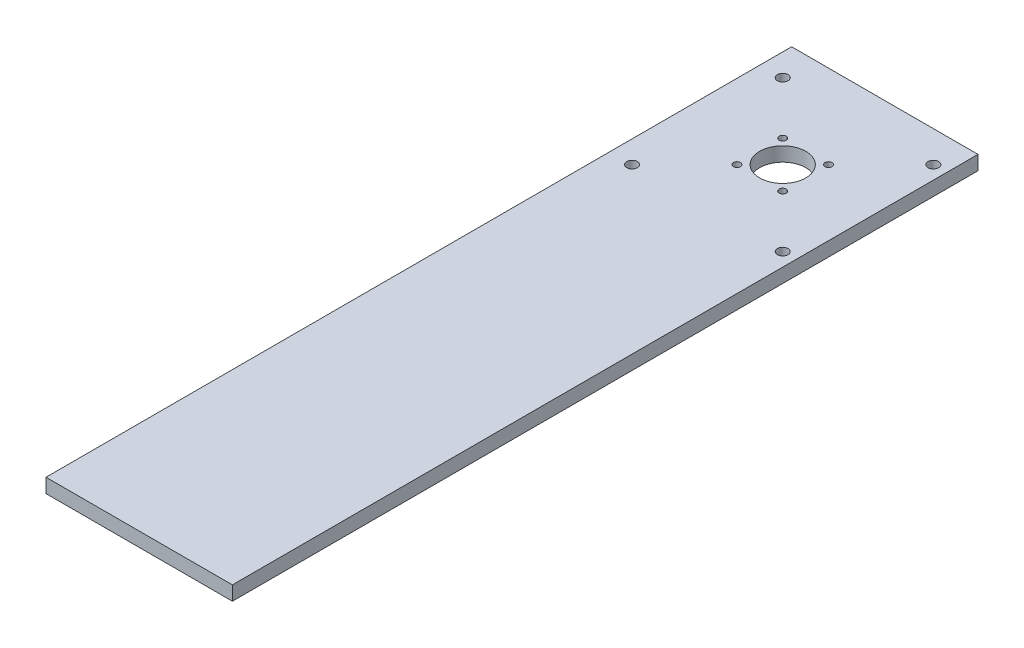
ISO-10303-21;
HEADER;
FILE_DESCRIPTION(('STEP AP214'),'2;1');
FILE_NAME('part.step','',(''),(''),'','','');
FILE_SCHEMA(('AUTOMOTIVE_DESIGN { 1 0 10303 214 1 1 1 1 }'));
ENDSEC;
DATA;
#1=APPLICATION_CONTEXT('core data for automotive mechanical design processes');
#2=APPLICATION_PROTOCOL_DEFINITION('international standard','automotive_design',2000,#1);
#3=PRODUCT_CONTEXT('',#1,'mechanical');
#4=PRODUCT('Part','Part','',(#3));
#5=PRODUCT_RELATED_PRODUCT_CATEGORY('part','',(#4));
#6=PRODUCT_DEFINITION_FORMATION('','',#4);
#7=PRODUCT_DEFINITION_CONTEXT('part definition',#1,'design');
#8=PRODUCT_DEFINITION('design','',#6,#7);
#9=PRODUCT_DEFINITION_SHAPE('','',#8);
#10=(LENGTH_UNIT() NAMED_UNIT(*) SI_UNIT(.MILLI.,.METRE.));
#11=(NAMED_UNIT(*) PLANE_ANGLE_UNIT() SI_UNIT($,.RADIAN.));
#12=(NAMED_UNIT(*) SI_UNIT($,.STERADIAN.) SOLID_ANGLE_UNIT());
#13=UNCERTAINTY_MEASURE_WITH_UNIT(LENGTH_MEASURE(1.E-05),#10,'distance_accuracy_value','');
#14=(GEOMETRIC_REPRESENTATION_CONTEXT(3) GLOBAL_UNCERTAINTY_ASSIGNED_CONTEXT((#13)) GLOBAL_UNIT_ASSIGNED_CONTEXT((#10,
#11,#12)) REPRESENTATION_CONTEXT('',''));
#15=CARTESIAN_POINT('',(0.,0.,0.));
#16=DIRECTION('',(0.,0.,1.));
#17=DIRECTION('',(1.,0.,0.));
#18=AXIS2_PLACEMENT_3D('',#15,#16,#17);
#19=CARTESIAN_POINT('',(0.,8.,0.));
#20=DIRECTION('',(0.,-1.,0.));
#21=DIRECTION('',(0.,0.,-1.));
#22=AXIS2_PLACEMENT_3D('',#19,#20,#21);
#23=PLANE('',#22);
#24=DIRECTION('',(0.,0.,-1.));
#25=VECTOR('',#24,1.);
#26=CARTESIAN_POINT('',(50.,8.,210.));
#27=LINE('',#26,#25);
#28=CARTESIAN_POINT('',(50.,8.,210.));
#29=VERTEX_POINT('',#28);
#30=CARTESIAN_POINT('',(50.,8.,-210.));
#31=VERTEX_POINT('',#30);
#32=EDGE_CURVE('E89',#29,#31,#27,.T.);
#33=ORIENTED_EDGE('',*,*,#32,.T.);
#34=DIRECTION('',(-1.,0.,0.));
#35=VECTOR('',#34,1.);
#36=CARTESIAN_POINT('',(-55.,8.,-210.));
#37=LINE('',#36,#35);
#38=CARTESIAN_POINT('',(-55.,8.,-210.));
#39=VERTEX_POINT('',#38);
#40=EDGE_CURVE('E84',#31,#39,#37,.T.);
#41=ORIENTED_EDGE('',*,*,#40,.T.);
#42=DIRECTION('',(0.,0.,1.));
#43=VECTOR('',#42,1.);
#44=CARTESIAN_POINT('',(-55.,8.,210.));
#45=LINE('',#44,#43);
#46=CARTESIAN_POINT('',(-55.,8.,210.));
#47=VERTEX_POINT('',#46);
#48=EDGE_CURVE('E87',#39,#47,#45,.T.);
#49=ORIENTED_EDGE('',*,*,#48,.T.);
#50=DIRECTION('',(1.,0.,0.));
#51=VECTOR('',#50,1.);
#52=CARTESIAN_POINT('',(-55.,8.,210.));
#53=LINE('',#52,#51);
#54=EDGE_CURVE('E54',#47,#29,#53,.T.);
#55=ORIENTED_EDGE('',*,*,#54,.T.);
#56=EDGE_LOOP('',(#33,#41,#49,#55));
#57=FACE_BOUND('',#56,.T.);
#58=CARTESIAN_POINT('',(0.,8.,-150.));
#59=DIRECTION('',(0.,1.,0.));
#60=DIRECTION('',(0.,0.,1.));
#61=AXIS2_PLACEMENT_3D('',#58,#59,#60);
#62=CIRCLE('',#61,13.);
#63=CARTESIAN_POINT('',(0.,8.,-137.));
#64=VERTEX_POINT('',#63);
#65=EDGE_CURVE('E104',#64,#64,#62,.T.);
#66=ORIENTED_EDGE('',*,*,#65,.F.);
#67=EDGE_LOOP('',(#66));
#68=FACE_BOUND('',#67,.T.);
#69=CARTESIAN_POINT('',(-42.4264068711926,8.,-107.573593128807));
#70=DIRECTION('',(0.,1.,0.));
#71=DIRECTION('',(0.,0.,1.));
#72=AXIS2_PLACEMENT_3D('',#69,#70,#71);
#73=CIRCLE('',#72,3.00000000000006);
#74=CARTESIAN_POINT('',(-42.4264068711926,8.,-104.573593128807));
#75=VERTEX_POINT('',#74);
#76=EDGE_CURVE('E119',#75,#75,#73,.T.);
#77=ORIENTED_EDGE('',*,*,#76,.F.);
#78=EDGE_LOOP('',(#77));
#79=FACE_BOUND('',#78,.T.);
#80=CARTESIAN_POINT('',(-12.9046987566544,8.,-137.095301243345));
#81=DIRECTION('',(0.,1.,0.));
#82=DIRECTION('',(0.,0.,1.));
#83=AXIS2_PLACEMENT_3D('',#80,#81,#82);
#84=CIRCLE('',#83,2.);
#85=CARTESIAN_POINT('',(-12.9046987566544,8.,-135.095301243345));
#86=VERTEX_POINT('',#85);
#87=EDGE_CURVE('E125',#86,#86,#84,.T.);
#88=ORIENTED_EDGE('',*,*,#87,.F.);
#89=EDGE_LOOP('',(#88));
#90=FACE_BOUND('',#89,.T.);
#91=CARTESIAN_POINT('',(-42.4264068711931,8.,-192.426406871193));
#92=DIRECTION('',(0.,1.,0.));
#93=DIRECTION('',(0.,0.,1.));
#94=AXIS2_PLACEMENT_3D('',#91,#92,#93);
#95=CIRCLE('',#94,2.99999999999999);
#96=CARTESIAN_POINT('',(-42.4264068711931,8.,-189.426406871193));
#97=VERTEX_POINT('',#96);
#98=EDGE_CURVE('E131',#97,#97,#95,.T.);
#99=ORIENTED_EDGE('',*,*,#98,.F.);
#100=EDGE_LOOP('',(#99));
#101=FACE_BOUND('',#100,.T.);
#102=CARTESIAN_POINT('',(42.4264068711926,8.,-192.426406871193));
#103=DIRECTION('',(0.,1.,0.));
#104=DIRECTION('',(0.,0.,1.));
#105=AXIS2_PLACEMENT_3D('',#102,#103,#104);
#106=CIRCLE('',#105,3.);
#107=CARTESIAN_POINT('',(42.4264068711926,8.,-189.426406871193));
#108=VERTEX_POINT('',#107);
#109=EDGE_CURVE('E137',#108,#108,#106,.T.);
#110=ORIENTED_EDGE('',*,*,#109,.F.);
#111=EDGE_LOOP('',(#110));
#112=FACE_BOUND('',#111,.T.);
#113=CARTESIAN_POINT('',(42.4264068711931,8.,-107.573593128807));
#114=DIRECTION('',(0.,1.,0.));
#115=DIRECTION('',(0.,0.,1.));
#116=AXIS2_PLACEMENT_3D('',#113,#114,#115);
#117=CIRCLE('',#116,3.00000000000001);
#118=CARTESIAN_POINT('',(42.4264068711931,8.,-104.573593128807));
#119=VERTEX_POINT('',#118);
#120=EDGE_CURVE('E143',#119,#119,#117,.T.);
#121=ORIENTED_EDGE('',*,*,#120,.F.);
#122=EDGE_LOOP('',(#121));
#123=FACE_BOUND('',#122,.T.);
#124=CARTESIAN_POINT('',(-12.9046987566546,8.,-162.904698756654));
#125=DIRECTION('',(0.,1.,0.));
#126=DIRECTION('',(0.,0.,1.));
#127=AXIS2_PLACEMENT_3D('',#124,#125,#126);
#128=CIRCLE('',#127,2.00000000000001);
#129=CARTESIAN_POINT('',(-12.9046987566546,8.,-160.904698756654));
#130=VERTEX_POINT('',#129);
#131=EDGE_CURVE('E149',#130,#130,#128,.T.);
#132=ORIENTED_EDGE('',*,*,#131,.F.);
#133=EDGE_LOOP('',(#132));
#134=FACE_BOUND('',#133,.T.);
#135=CARTESIAN_POINT('',(12.9046987566544,8.,-162.904698756655));
#136=DIRECTION('',(0.,1.,0.));
#137=DIRECTION('',(0.,0.,1.));
#138=AXIS2_PLACEMENT_3D('',#135,#136,#137);
#139=CIRCLE('',#138,2.);
#140=CARTESIAN_POINT('',(12.9046987566544,8.,-160.904698756655));
#141=VERTEX_POINT('',#140);
#142=EDGE_CURVE('E155',#141,#141,#139,.T.);
#143=ORIENTED_EDGE('',*,*,#142,.F.);
#144=EDGE_LOOP('',(#143));
#145=FACE_BOUND('',#144,.T.);
#146=CARTESIAN_POINT('',(12.9046987566546,8.,-137.095301243346));
#147=DIRECTION('',(0.,1.,0.));
#148=DIRECTION('',(0.,0.,1.));
#149=AXIS2_PLACEMENT_3D('',#146,#147,#148);
#150=CIRCLE('',#149,2.00000000000001);
#151=CARTESIAN_POINT('',(12.9046987566546,8.,-135.095301243346));
#152=VERTEX_POINT('',#151);
#153=EDGE_CURVE('E161',#152,#152,#150,.T.);
#154=ORIENTED_EDGE('',*,*,#153,.F.);
#155=EDGE_LOOP('',(#154));
#156=FACE_BOUND('',#155,.T.);
#157=ADVANCED_FACE('F37',(#57,#68,#79,#90,#101,#112,#123,#134,#145,#156),#23,.F.);
#158=CARTESIAN_POINT('',(0.,0.,0.));
#159=DIRECTION('',(0.,-1.,0.));
#160=DIRECTION('',(0.,0.,-1.));
#161=AXIS2_PLACEMENT_3D('',#158,#159,#160);
#162=PLANE('',#161);
#163=CARTESIAN_POINT('',(12.9046987566544,0.,-162.904698756655));
#164=DIRECTION('',(0.,1.,0.));
#165=DIRECTION('',(0.,0.,1.));
#166=AXIS2_PLACEMENT_3D('',#163,#164,#165);
#167=CIRCLE('',#166,2.);
#168=CARTESIAN_POINT('',(12.9046987566544,0.,-160.904698756655));
#169=VERTEX_POINT('',#168);
#170=EDGE_CURVE('E158',#169,#169,#167,.T.);
#171=ORIENTED_EDGE('',*,*,#170,.T.);
#172=EDGE_LOOP('',(#171));
#173=FACE_BOUND('',#172,.T.);
#174=CARTESIAN_POINT('',(42.4264068711931,0.,-107.573593128807));
#175=DIRECTION('',(0.,1.,0.));
#176=DIRECTION('',(0.,0.,1.));
#177=AXIS2_PLACEMENT_3D('',#174,#175,#176);
#178=CIRCLE('',#177,3.00000000000001);
#179=CARTESIAN_POINT('',(42.4264068711931,0.,-104.573593128807));
#180=VERTEX_POINT('',#179);
#181=EDGE_CURVE('E146',#180,#180,#178,.T.);
#182=ORIENTED_EDGE('',*,*,#181,.T.);
#183=EDGE_LOOP('',(#182));
#184=FACE_BOUND('',#183,.T.);
#185=CARTESIAN_POINT('',(-42.4264068711931,0.,-192.426406871193));
#186=DIRECTION('',(0.,1.,0.));
#187=DIRECTION('',(0.,0.,1.));
#188=AXIS2_PLACEMENT_3D('',#185,#186,#187);
#189=CIRCLE('',#188,2.99999999999999);
#190=CARTESIAN_POINT('',(-42.4264068711931,0.,-189.426406871193));
#191=VERTEX_POINT('',#190);
#192=EDGE_CURVE('E134',#191,#191,#189,.T.);
#193=ORIENTED_EDGE('',*,*,#192,.T.);
#194=EDGE_LOOP('',(#193));
#195=FACE_BOUND('',#194,.T.);
#196=CARTESIAN_POINT('',(-42.4264068711926,0.,-107.573593128807));
#197=DIRECTION('',(0.,1.,0.));
#198=DIRECTION('',(0.,0.,1.));
#199=AXIS2_PLACEMENT_3D('',#196,#197,#198);
#200=CIRCLE('',#199,3.00000000000006);
#201=CARTESIAN_POINT('',(-42.4264068711926,0.,-104.573593128807));
#202=VERTEX_POINT('',#201);
#203=EDGE_CURVE('E122',#202,#202,#200,.T.);
#204=ORIENTED_EDGE('',*,*,#203,.T.);
#205=EDGE_LOOP('',(#204));
#206=FACE_BOUND('',#205,.T.);
#207=DIRECTION('',(0.,0.,-1.));
#208=VECTOR('',#207,1.);
#209=CARTESIAN_POINT('',(50.,0.,210.));
#210=LINE('',#209,#208);
#211=CARTESIAN_POINT('',(50.,0.,210.));
#212=VERTEX_POINT('',#211);
#213=CARTESIAN_POINT('',(50.,0.,-210.));
#214=VERTEX_POINT('',#213);
#215=EDGE_CURVE('E101',#212,#214,#210,.T.);
#216=ORIENTED_EDGE('',*,*,#215,.F.);
#217=DIRECTION('',(1.,0.,0.));
#218=VECTOR('',#217,1.);
#219=CARTESIAN_POINT('',(-55.,0.,210.));
#220=LINE('',#219,#218);
#221=CARTESIAN_POINT('',(-55.,0.,210.));
#222=VERTEX_POINT('',#221);
#223=EDGE_CURVE('E77',#222,#212,#220,.T.);
#224=ORIENTED_EDGE('',*,*,#223,.F.);
#225=DIRECTION('',(0.,0.,1.));
#226=VECTOR('',#225,1.);
#227=CARTESIAN_POINT('',(-55.,0.,210.));
#228=LINE('',#227,#226);
#229=CARTESIAN_POINT('',(-55.,0.,-210.));
#230=VERTEX_POINT('',#229);
#231=EDGE_CURVE('E71',#230,#222,#228,.T.);
#232=ORIENTED_EDGE('',*,*,#231,.F.);
#233=DIRECTION('',(-1.,0.,0.));
#234=VECTOR('',#233,1.);
#235=CARTESIAN_POINT('',(-55.,0.,-210.));
#236=LINE('',#235,#234);
#237=EDGE_CURVE('E93',#214,#230,#236,.T.);
#238=ORIENTED_EDGE('',*,*,#237,.F.);
#239=EDGE_LOOP('',(#216,#224,#232,#238));
#240=FACE_BOUND('',#239,.T.);
#241=CARTESIAN_POINT('',(0.,0.,-150.));
#242=DIRECTION('',(0.,1.,0.));
#243=DIRECTION('',(0.,0.,1.));
#244=AXIS2_PLACEMENT_3D('',#241,#242,#243);
#245=CIRCLE('',#244,13.);
#246=CARTESIAN_POINT('',(0.,0.,-137.));
#247=VERTEX_POINT('',#246);
#248=EDGE_CURVE('E116',#247,#247,#245,.T.);
#249=ORIENTED_EDGE('',*,*,#248,.T.);
#250=EDGE_LOOP('',(#249));
#251=FACE_BOUND('',#250,.T.);
#252=CARTESIAN_POINT('',(-12.9046987566544,0.,-137.095301243345));
#253=DIRECTION('',(0.,1.,0.));
#254=DIRECTION('',(0.,0.,1.));
#255=AXIS2_PLACEMENT_3D('',#252,#253,#254);
#256=CIRCLE('',#255,2.);
#257=CARTESIAN_POINT('',(-12.9046987566544,0.,-135.095301243345));
#258=VERTEX_POINT('',#257);
#259=EDGE_CURVE('E128',#258,#258,#256,.T.);
#260=ORIENTED_EDGE('',*,*,#259,.T.);
#261=EDGE_LOOP('',(#260));
#262=FACE_BOUND('',#261,.T.);
#263=CARTESIAN_POINT('',(42.4264068711926,0.,-192.426406871193));
#264=DIRECTION('',(0.,1.,0.));
#265=DIRECTION('',(0.,0.,1.));
#266=AXIS2_PLACEMENT_3D('',#263,#264,#265);
#267=CIRCLE('',#266,3.);
#268=CARTESIAN_POINT('',(42.4264068711926,0.,-189.426406871193));
#269=VERTEX_POINT('',#268);
#270=EDGE_CURVE('E140',#269,#269,#267,.T.);
#271=ORIENTED_EDGE('',*,*,#270,.T.);
#272=EDGE_LOOP('',(#271));
#273=FACE_BOUND('',#272,.T.);
#274=CARTESIAN_POINT('',(-12.9046987566546,0.,-162.904698756654));
#275=DIRECTION('',(0.,1.,0.));
#276=DIRECTION('',(0.,0.,1.));
#277=AXIS2_PLACEMENT_3D('',#274,#275,#276);
#278=CIRCLE('',#277,2.00000000000001);
#279=CARTESIAN_POINT('',(-12.9046987566546,0.,-160.904698756654));
#280=VERTEX_POINT('',#279);
#281=EDGE_CURVE('E152',#280,#280,#278,.T.);
#282=ORIENTED_EDGE('',*,*,#281,.T.);
#283=EDGE_LOOP('',(#282));
#284=FACE_BOUND('',#283,.T.);
#285=CARTESIAN_POINT('',(12.9046987566546,0.,-137.095301243346));
#286=DIRECTION('',(0.,1.,0.));
#287=DIRECTION('',(0.,0.,1.));
#288=AXIS2_PLACEMENT_3D('',#285,#286,#287);
#289=CIRCLE('',#288,2.00000000000001);
#290=CARTESIAN_POINT('',(12.9046987566546,0.,-135.095301243346));
#291=VERTEX_POINT('',#290);
#292=EDGE_CURVE('E164',#291,#291,#289,.T.);
#293=ORIENTED_EDGE('',*,*,#292,.T.);
#294=EDGE_LOOP('',(#293));
#295=FACE_BOUND('',#294,.T.);
#296=ADVANCED_FACE('F112',(#173,#184,#195,#206,#240,#251,#262,#273,#284,#295),#162,.T.);
#297=CARTESIAN_POINT('',(50.,8.,210.));
#298=DIRECTION('',(-1.,0.,0.));
#299=DIRECTION('',(0.,0.,1.));
#300=AXIS2_PLACEMENT_3D('',#297,#298,#299);
#301=PLANE('',#300);
#302=ORIENTED_EDGE('',*,*,#215,.T.);
#303=DIRECTION('',(0.,-1.,0.));
#304=VECTOR('',#303,1.);
#305=CARTESIAN_POINT('',(50.,8.,-210.));
#306=LINE('',#305,#304);
#307=EDGE_CURVE('E11',#31,#214,#306,.T.);
#308=ORIENTED_EDGE('',*,*,#307,.F.);
#309=ORIENTED_EDGE('',*,*,#32,.F.);
#310=DIRECTION('',(0.,-1.,0.));
#311=VECTOR('',#310,1.);
#312=CARTESIAN_POINT('',(50.,8.,210.));
#313=LINE('',#312,#311);
#314=EDGE_CURVE('E97',#29,#212,#313,.T.);
#315=ORIENTED_EDGE('',*,*,#314,.T.);
#316=EDGE_LOOP('',(#302,#308,#309,#315));
#317=FACE_BOUND('',#316,.T.);
#318=ADVANCED_FACE('F39',(#317),#301,.F.);
#319=CARTESIAN_POINT('',(-55.,8.,-210.));
#320=DIRECTION('',(0.,0.,1.));
#321=DIRECTION('',(1.,0.,0.));
#322=AXIS2_PLACEMENT_3D('',#319,#320,#321);
#323=PLANE('',#322);
#324=ORIENTED_EDGE('',*,*,#237,.T.);
#325=DIRECTION('',(0.,-1.,0.));
#326=VECTOR('',#325,1.);
#327=CARTESIAN_POINT('',(-55.,8.,-210.));
#328=LINE('',#327,#326);
#329=EDGE_CURVE('E46',#39,#230,#328,.T.);
#330=ORIENTED_EDGE('',*,*,#329,.F.);
#331=ORIENTED_EDGE('',*,*,#40,.F.);
#332=ORIENTED_EDGE('',*,*,#307,.T.);
#333=EDGE_LOOP('',(#324,#330,#331,#332));
#334=FACE_BOUND('',#333,.T.);
#335=ADVANCED_FACE('F92',(#334),#323,.F.);
#336=CARTESIAN_POINT('',(-55.,8.,210.));
#337=DIRECTION('',(1.,0.,0.));
#338=DIRECTION('',(0.,0.,-1.));
#339=AXIS2_PLACEMENT_3D('',#336,#337,#338);
#340=PLANE('',#339);
#341=ORIENTED_EDGE('',*,*,#231,.T.);
#342=DIRECTION('',(0.,-1.,0.));
#343=VECTOR('',#342,1.);
#344=CARTESIAN_POINT('',(-55.,8.,210.));
#345=LINE('',#344,#343);
#346=EDGE_CURVE('E94',#47,#222,#345,.T.);
#347=ORIENTED_EDGE('',*,*,#346,.F.);
#348=ORIENTED_EDGE('',*,*,#48,.F.);
#349=ORIENTED_EDGE('',*,*,#329,.T.);
#350=EDGE_LOOP('',(#341,#347,#348,#349));
#351=FACE_BOUND('',#350,.T.);
#352=ADVANCED_FACE('F95',(#351),#340,.F.);
#353=CARTESIAN_POINT('',(-55.,8.,210.));
#354=DIRECTION('',(0.,0.,-1.));
#355=DIRECTION('',(-1.,0.,0.));
#356=AXIS2_PLACEMENT_3D('',#353,#354,#355);
#357=PLANE('',#356);
#358=ORIENTED_EDGE('',*,*,#223,.T.);
#359=ORIENTED_EDGE('',*,*,#314,.F.);
#360=ORIENTED_EDGE('',*,*,#54,.F.);
#361=ORIENTED_EDGE('',*,*,#346,.T.);
#362=EDGE_LOOP('',(#358,#359,#360,#361));
#363=FACE_BOUND('',#362,.T.);
#364=ADVANCED_FACE('F109',(#363),#357,.F.);
#365=CARTESIAN_POINT('',(0.,8.,-150.));
#366=DIRECTION('',(0.,-1.,0.));
#367=DIRECTION('',(0.,0.,-1.));
#368=AXIS2_PLACEMENT_3D('',#365,#366,#367);
#369=CYLINDRICAL_SURFACE('',#368,13.);
#370=ORIENTED_EDGE('',*,*,#65,.T.);
#371=EDGE_LOOP('',(#370));
#372=FACE_BOUND('',#371,.T.);
#373=ORIENTED_EDGE('',*,*,#248,.F.);
#374=EDGE_LOOP('',(#373));
#375=FACE_BOUND('',#374,.T.);
#376=ADVANCED_FACE('F181',(#372,#375),#369,.F.);
#377=CARTESIAN_POINT('',(-42.4264068711926,8.,-107.573593128807));
#378=DIRECTION('',(0.,-1.,0.));
#379=DIRECTION('',(0.,0.,-1.));
#380=AXIS2_PLACEMENT_3D('',#377,#378,#379);
#381=CYLINDRICAL_SURFACE('',#380,3.00000000000006);
#382=ORIENTED_EDGE('',*,*,#76,.T.);
#383=EDGE_LOOP('',(#382));
#384=FACE_BOUND('',#383,.T.);
#385=ORIENTED_EDGE('',*,*,#203,.F.);
#386=EDGE_LOOP('',(#385));
#387=FACE_BOUND('',#386,.T.);
#388=ADVANCED_FACE('F235',(#384,#387),#381,.F.);
#389=CARTESIAN_POINT('',(-12.9046987566544,8.,-137.095301243345));
#390=DIRECTION('',(0.,-1.,0.));
#391=DIRECTION('',(0.,0.,-1.));
#392=AXIS2_PLACEMENT_3D('',#389,#390,#391);
#393=CYLINDRICAL_SURFACE('',#392,2.);
#394=ORIENTED_EDGE('',*,*,#87,.T.);
#395=EDGE_LOOP('',(#394));
#396=FACE_BOUND('',#395,.T.);
#397=ORIENTED_EDGE('',*,*,#259,.F.);
#398=EDGE_LOOP('',(#397));
#399=FACE_BOUND('',#398,.T.);
#400=ADVANCED_FACE('F244',(#396,#399),#393,.F.);
#401=CARTESIAN_POINT('',(-42.4264068711931,8.,-192.426406871193));
#402=DIRECTION('',(0.,-1.,0.));
#403=DIRECTION('',(0.,0.,-1.));
#404=AXIS2_PLACEMENT_3D('',#401,#402,#403);
#405=CYLINDRICAL_SURFACE('',#404,2.99999999999999);
#406=ORIENTED_EDGE('',*,*,#98,.T.);
#407=EDGE_LOOP('',(#406));
#408=FACE_BOUND('',#407,.T.);
#409=ORIENTED_EDGE('',*,*,#192,.F.);
#410=EDGE_LOOP('',(#409));
#411=FACE_BOUND('',#410,.T.);
#412=ADVANCED_FACE('F253',(#408,#411),#405,.F.);
#413=CARTESIAN_POINT('',(42.4264068711926,8.,-192.426406871193));
#414=DIRECTION('',(0.,-1.,0.));
#415=DIRECTION('',(0.,0.,-1.));
#416=AXIS2_PLACEMENT_3D('',#413,#414,#415);
#417=CYLINDRICAL_SURFACE('',#416,3.);
#418=ORIENTED_EDGE('',*,*,#109,.T.);
#419=EDGE_LOOP('',(#418));
#420=FACE_BOUND('',#419,.T.);
#421=ORIENTED_EDGE('',*,*,#270,.F.);
#422=EDGE_LOOP('',(#421));
#423=FACE_BOUND('',#422,.T.);
#424=ADVANCED_FACE('F263',(#420,#423),#417,.F.);
#425=CARTESIAN_POINT('',(42.4264068711931,8.,-107.573593128807));
#426=DIRECTION('',(0.,-1.,0.));
#427=DIRECTION('',(0.,0.,-1.));
#428=AXIS2_PLACEMENT_3D('',#425,#426,#427);
#429=CYLINDRICAL_SURFACE('',#428,3.00000000000001);
#430=ORIENTED_EDGE('',*,*,#120,.T.);
#431=EDGE_LOOP('',(#430));
#432=FACE_BOUND('',#431,.T.);
#433=ORIENTED_EDGE('',*,*,#181,.F.);
#434=EDGE_LOOP('',(#433));
#435=FACE_BOUND('',#434,.T.);
#436=ADVANCED_FACE('F273',(#432,#435),#429,.F.);
#437=CARTESIAN_POINT('',(-12.9046987566546,8.,-162.904698756654));
#438=DIRECTION('',(0.,-1.,0.));
#439=DIRECTION('',(0.,0.,-1.));
#440=AXIS2_PLACEMENT_3D('',#437,#438,#439);
#441=CYLINDRICAL_SURFACE('',#440,2.00000000000001);
#442=ORIENTED_EDGE('',*,*,#131,.T.);
#443=EDGE_LOOP('',(#442));
#444=FACE_BOUND('',#443,.T.);
#445=ORIENTED_EDGE('',*,*,#281,.F.);
#446=EDGE_LOOP('',(#445));
#447=FACE_BOUND('',#446,.T.);
#448=ADVANCED_FACE('F283',(#444,#447),#441,.F.);
#449=CARTESIAN_POINT('',(12.9046987566544,8.,-162.904698756655));
#450=DIRECTION('',(0.,-1.,0.));
#451=DIRECTION('',(0.,0.,-1.));
#452=AXIS2_PLACEMENT_3D('',#449,#450,#451);
#453=CYLINDRICAL_SURFACE('',#452,2.);
#454=ORIENTED_EDGE('',*,*,#142,.T.);
#455=EDGE_LOOP('',(#454));
#456=FACE_BOUND('',#455,.T.);
#457=ORIENTED_EDGE('',*,*,#170,.F.);
#458=EDGE_LOOP('',(#457));
#459=FACE_BOUND('',#458,.T.);
#460=ADVANCED_FACE('F293',(#456,#459),#453,.F.);
#461=CARTESIAN_POINT('',(12.9046987566546,8.,-137.095301243346));
#462=DIRECTION('',(0.,-1.,0.));
#463=DIRECTION('',(0.,0.,-1.));
#464=AXIS2_PLACEMENT_3D('',#461,#462,#463);
#465=CYLINDRICAL_SURFACE('',#464,2.00000000000001);
#466=ORIENTED_EDGE('',*,*,#153,.T.);
#467=EDGE_LOOP('',(#466));
#468=FACE_BOUND('',#467,.T.);
#469=ORIENTED_EDGE('',*,*,#292,.F.);
#470=EDGE_LOOP('',(#469));
#471=FACE_BOUND('',#470,.T.);
#472=ADVANCED_FACE('F170',(#468,#471),#465,.F.);
#473=CLOSED_SHELL('',(#157,#296,#318,#335,#352,#364,#376,#388,#400,#412,#424,#436,#448,#460,#472));
#474=MANIFOLD_SOLID_BREP('B2',#473);
#475=ADVANCED_BREP_SHAPE_REPRESENTATION('',(#18,#474),#14);
#476=SHAPE_DEFINITION_REPRESENTATION(#9,#475);
ENDSEC;
END-ISO-10303-21;
